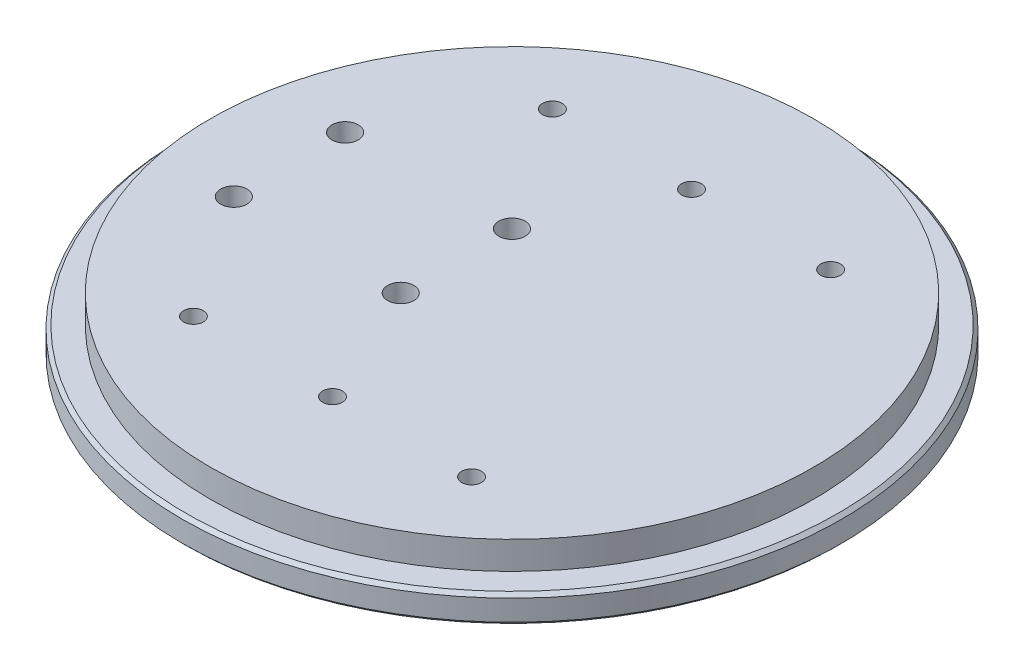
ISO-10303-21;
HEADER;
FILE_DESCRIPTION(('STEP AP214'),'2;1');
FILE_NAME('part.step','',(''),(''),'','','');
FILE_SCHEMA(('AUTOMOTIVE_DESIGN { 1 0 10303 214 1 1 1 1 }'));
ENDSEC;
DATA;
#1=APPLICATION_CONTEXT('core data for automotive mechanical design processes');
#2=APPLICATION_PROTOCOL_DEFINITION('international standard','automotive_design',2000,#1);
#3=PRODUCT_CONTEXT('',#1,'mechanical');
#4=PRODUCT('Part','Part','',(#3));
#5=PRODUCT_RELATED_PRODUCT_CATEGORY('part','',(#4));
#6=PRODUCT_DEFINITION_FORMATION('','',#4);
#7=PRODUCT_DEFINITION_CONTEXT('part definition',#1,'design');
#8=PRODUCT_DEFINITION('design','',#6,#7);
#9=PRODUCT_DEFINITION_SHAPE('','',#8);
#10=(LENGTH_UNIT() NAMED_UNIT(*) SI_UNIT(.MILLI.,.METRE.));
#11=(NAMED_UNIT(*) PLANE_ANGLE_UNIT() SI_UNIT($,.RADIAN.));
#12=(NAMED_UNIT(*) SI_UNIT($,.STERADIAN.) SOLID_ANGLE_UNIT());
#13=UNCERTAINTY_MEASURE_WITH_UNIT(LENGTH_MEASURE(1.E-05),#10,'distance_accuracy_value','');
#14=(GEOMETRIC_REPRESENTATION_CONTEXT(3) GLOBAL_UNCERTAINTY_ASSIGNED_CONTEXT((#13)) GLOBAL_UNIT_ASSIGNED_CONTEXT((#10,
#11,#12)) REPRESENTATION_CONTEXT('',''));
#15=CARTESIAN_POINT('',(0.,0.,0.));
#16=DIRECTION('',(0.,0.,1.));
#17=DIRECTION('',(1.,0.,0.));
#18=AXIS2_PLACEMENT_3D('',#15,#16,#17);
#19=CARTESIAN_POINT('',(0.,-114.3,0.));
#20=DIRECTION('',(0.,-1.,0.));
#21=DIRECTION('',(0.,0.,-1.));
#22=AXIS2_PLACEMENT_3D('',#19,#20,#21);
#23=PLANE('',#22);
#24=CARTESIAN_POINT('',(0.,-114.3,0.));
#25=DIRECTION('',(0.,-1.,0.));
#26=DIRECTION('',(0.,0.,-1.));
#27=AXIS2_PLACEMENT_3D('',#24,#25,#26);
#28=CIRCLE('',#27,74.4388043157519);
#29=CARTESIAN_POINT('',(0.,-114.3,74.4388043157519));
#30=VERTEX_POINT('',#29);
#31=EDGE_CURVE('E206',#30,#30,#28,.T.);
#32=ORIENTED_EDGE('',*,*,#31,.T.);
#33=EDGE_LOOP('',(#32));
#34=FACE_BOUND('',#33,.T.);
#35=CARTESIAN_POINT('',(0.,-114.3,0.));
#36=DIRECTION('',(0.,-1.,0.));
#37=DIRECTION('',(0.,0.,-1.));
#38=AXIS2_PLACEMENT_3D('',#35,#36,#37);
#39=CIRCLE('',#38,8.);
#40=CARTESIAN_POINT('',(5.96284793999944,-114.3,5.33333333333333));
#41=VERTEX_POINT('',#40);
#42=CARTESIAN_POINT('',(5.96284793999944,-114.3,-5.33333333333333));
#43=VERTEX_POINT('',#42);
#44=EDGE_CURVE('E188',#41,#43,#39,.T.);
#45=ORIENTED_EDGE('',*,*,#44,.F.);
#46=CARTESIAN_POINT('',(8.94427190999916,-114.3,8.));
#47=DIRECTION('',(0.,-1.,0.));
#48=DIRECTION('',(0.,0.,-1.));
#49=AXIS2_PLACEMENT_3D('',#46,#47,#48);
#50=CIRCLE('',#49,4.);
#51=CARTESIAN_POINT('',(8.94427190999917,-114.3,4.));
#52=VERTEX_POINT('',#51);
#53=EDGE_CURVE('E152',#41,#52,#50,.T.);
#54=ORIENTED_EDGE('',*,*,#53,.T.);
#55=DIRECTION('',(-1.,0.,0.));
#56=VECTOR('',#55,1.);
#57=CARTESIAN_POINT('',(28.,-114.3,4.));
#58=LINE('',#57,#56);
#59=CARTESIAN_POINT('',(24.,-114.3,4.));
#60=VERTEX_POINT('',#59);
#61=EDGE_CURVE('E194',#60,#52,#58,.T.);
#62=ORIENTED_EDGE('',*,*,#61,.F.);
#63=CARTESIAN_POINT('',(24.,-114.3,0.));
#64=DIRECTION('',(0.,-1.,0.));
#65=DIRECTION('',(0.,0.,-1.));
#66=AXIS2_PLACEMENT_3D('',#63,#64,#65);
#67=CIRCLE('',#66,4.);
#68=CARTESIAN_POINT('',(28.,-114.3,0.));
#69=VERTEX_POINT('',#68);
#70=EDGE_CURVE('E60',#60,#69,#67,.F.);
#71=ORIENTED_EDGE('',*,*,#70,.T.);
#72=CARTESIAN_POINT('',(24.,-114.3,0.));
#73=DIRECTION('',(0.,-1.,0.));
#74=DIRECTION('',(0.,0.,-1.));
#75=AXIS2_PLACEMENT_3D('',#72,#73,#74);
#76=CIRCLE('',#75,4.);
#77=CARTESIAN_POINT('',(24.,-114.3,-4.));
#78=VERTEX_POINT('',#77);
#79=EDGE_CURVE('E13',#69,#78,#76,.F.);
#80=ORIENTED_EDGE('',*,*,#79,.T.);
#81=DIRECTION('',(1.,0.,0.));
#82=VECTOR('',#81,1.);
#83=CARTESIAN_POINT('',(28.,-114.3,-4.));
#84=LINE('',#83,#82);
#85=CARTESIAN_POINT('',(8.94427190999917,-114.3,-4.));
#86=VERTEX_POINT('',#85);
#87=EDGE_CURVE('E128',#86,#78,#84,.T.);
#88=ORIENTED_EDGE('',*,*,#87,.F.);
#89=CARTESIAN_POINT('',(8.94427190999916,-114.3,-7.99999999999999));
#90=DIRECTION('',(0.,-1.,0.));
#91=DIRECTION('',(0.,0.,-1.));
#92=AXIS2_PLACEMENT_3D('',#89,#90,#91);
#93=CIRCLE('',#92,4.);
#94=EDGE_CURVE('E149',#86,#43,#93,.T.);
#95=ORIENTED_EDGE('',*,*,#94,.T.);
#96=EDGE_LOOP('',(#45,#54,#62,#71,#80,#88,#95));
#97=FACE_BOUND('',#96,.T.);
#98=ADVANCED_FACE('F50',(#34,#97),#23,.T.);
#99=CARTESIAN_POINT('',(0.,-107.95,0.));
#100=DIRECTION('',(0.,-1.,0.));
#101=DIRECTION('',(0.,0.,-1.));
#102=AXIS2_PLACEMENT_3D('',#99,#100,#101);
#103=CYLINDRICAL_SURFACE('',#102,8.);
#104=CARTESIAN_POINT('',(0.,-107.95,0.));
#105=DIRECTION('',(0.,-1.,0.));
#106=DIRECTION('',(0.,0.,-1.));
#107=AXIS2_PLACEMENT_3D('',#104,#105,#106);
#108=CIRCLE('',#107,8.);
#109=CARTESIAN_POINT('',(5.96284793999944,-107.95,5.33333333333333));
#110=VERTEX_POINT('',#109);
#111=CARTESIAN_POINT('',(5.96284793999944,-107.95,-5.33333333333333));
#112=VERTEX_POINT('',#111);
#113=EDGE_CURVE('E174',#110,#112,#108,.T.);
#114=ORIENTED_EDGE('',*,*,#113,.F.);
#115=DIRECTION('',(0.,-1.,0.));
#116=VECTOR('',#115,1.);
#117=CARTESIAN_POINT('',(5.96284793999944,-107.95,5.33333333333333));
#118=LINE('',#117,#116);
#119=EDGE_CURVE('E146',#110,#41,#118,.T.);
#120=ORIENTED_EDGE('',*,*,#119,.T.);
#121=ORIENTED_EDGE('',*,*,#44,.T.);
#122=DIRECTION('',(0.,-1.,0.));
#123=VECTOR('',#122,1.);
#124=CARTESIAN_POINT('',(5.96284793999944,-107.95,-5.33333333333333));
#125=LINE('',#124,#123);
#126=EDGE_CURVE('E137',#43,#112,#125,.F.);
#127=ORIENTED_EDGE('',*,*,#126,.T.);
#128=EDGE_LOOP('',(#114,#120,#121,#127));
#129=FACE_BOUND('',#128,.T.);
#130=ADVANCED_FACE('F191',(#129),#103,.F.);
#131=CARTESIAN_POINT('',(0.,-107.95,0.));
#132=DIRECTION('',(0.,1.,0.));
#133=DIRECTION('',(0.,0.,1.));
#134=AXIS2_PLACEMENT_3D('',#131,#132,#133);
#135=CYLINDRICAL_SURFACE('',#134,68.8825543157519);
#136=CARTESIAN_POINT('',(0.,-107.95,0.));
#137=DIRECTION('',(0.,-1.,0.));
#138=DIRECTION('',(0.,0.,-1.));
#139=AXIS2_PLACEMENT_3D('',#136,#137,#138);
#140=CIRCLE('',#139,68.8825543157519);
#141=CARTESIAN_POINT('',(0.,-107.95,-68.8825543157519));
#142=VERTEX_POINT('',#141);
#143=EDGE_CURVE('E202',#142,#142,#140,.T.);
#144=ORIENTED_EDGE('',*,*,#143,.F.);
#145=EDGE_LOOP('',(#144));
#146=FACE_BOUND('',#145,.T.);
#147=CARTESIAN_POINT('',(0.,-101.6,0.));
#148=DIRECTION('',(0.,-1.,0.));
#149=DIRECTION('',(0.,0.,-1.));
#150=AXIS2_PLACEMENT_3D('',#147,#148,#149);
#151=CIRCLE('',#150,68.8825543157519);
#152=CARTESIAN_POINT('',(0.,-101.6,-68.8825543157519));
#153=VERTEX_POINT('',#152);
#154=EDGE_CURVE('E198',#153,#153,#151,.T.);
#155=ORIENTED_EDGE('',*,*,#154,.T.);
#156=EDGE_LOOP('',(#155));
#157=FACE_BOUND('',#156,.T.);
#158=ADVANCED_FACE('F237',(#146,#157),#135,.T.);
#159=CARTESIAN_POINT('',(0.,-101.6,0.));
#160=DIRECTION('',(0.,-1.,0.));
#161=DIRECTION('',(0.,0.,-1.));
#162=AXIS2_PLACEMENT_3D('',#159,#160,#161);
#163=PLANE('',#162);
#164=ORIENTED_EDGE('',*,*,#154,.F.);
#165=EDGE_LOOP('',(#164));
#166=FACE_BOUND('',#165,.T.);
#167=CARTESIAN_POINT('',(-50.8,-101.6,-12.7));
#168=DIRECTION('',(0.,1.,0.));
#169=DIRECTION('',(0.,0.,1.));
#170=AXIS2_PLACEMENT_3D('',#167,#168,#169);
#171=CIRCLE('',#170,3.);
#172=CARTESIAN_POINT('',(-50.8,-101.6,-9.7));
#173=VERTEX_POINT('',#172);
#174=EDGE_CURVE('E316',#173,#173,#171,.T.);
#175=ORIENTED_EDGE('',*,*,#174,.F.);
#176=EDGE_LOOP('',(#175));
#177=FACE_BOUND('',#176,.T.);
#178=CARTESIAN_POINT('',(-12.7,-101.6,12.7));
#179=DIRECTION('',(0.,1.,0.));
#180=DIRECTION('',(0.,0.,1.));
#181=AXIS2_PLACEMENT_3D('',#178,#179,#180);
#182=CIRCLE('',#181,3.);
#183=CARTESIAN_POINT('',(-12.7,-101.6,15.7));
#184=VERTEX_POINT('',#183);
#185=EDGE_CURVE('E324',#184,#184,#182,.T.);
#186=ORIENTED_EDGE('',*,*,#185,.F.);
#187=EDGE_LOOP('',(#186));
#188=FACE_BOUND('',#187,.T.);
#189=CARTESIAN_POINT('',(-50.8,-101.6,12.7));
#190=DIRECTION('',(0.,1.,0.));
#191=DIRECTION('',(0.,0.,1.));
#192=AXIS2_PLACEMENT_3D('',#189,#190,#191);
#193=CIRCLE('',#192,3.);
#194=CARTESIAN_POINT('',(-50.8,-101.6,15.7));
#195=VERTEX_POINT('',#194);
#196=EDGE_CURVE('E325',#195,#195,#193,.T.);
#197=ORIENTED_EDGE('',*,*,#196,.F.);
#198=EDGE_LOOP('',(#197));
#199=FACE_BOUND('',#198,.T.);
#200=CARTESIAN_POINT('',(-12.7,-101.6,-12.7));
#201=DIRECTION('',(0.,1.,0.));
#202=DIRECTION('',(0.,0.,1.));
#203=AXIS2_PLACEMENT_3D('',#200,#201,#202);
#204=CIRCLE('',#203,3.);
#205=CARTESIAN_POINT('',(-12.7,-101.6,-9.7));
#206=VERTEX_POINT('',#205);
#207=EDGE_CURVE('E311',#206,#206,#204,.T.);
#208=ORIENTED_EDGE('',*,*,#207,.F.);
#209=EDGE_LOOP('',(#208));
#210=FACE_BOUND('',#209,.T.);
#211=CARTESIAN_POINT('',(-31.75,-101.6,40.979606549068));
#212=DIRECTION('',(0.,-1.,0.));
#213=DIRECTION('',(0.,0.,-1.));
#214=AXIS2_PLACEMENT_3D('',#211,#212,#213);
#215=CIRCLE('',#214,2.25);
#216=CARTESIAN_POINT('',(-31.75,-101.6,38.729606549068));
#217=VERTEX_POINT('',#216);
#218=EDGE_CURVE('E355',#217,#217,#215,.T.);
#219=ORIENTED_EDGE('',*,*,#218,.T.);
#220=EDGE_LOOP('',(#219));
#221=FACE_BOUND('',#220,.T.);
#222=CARTESIAN_POINT('',(31.75,-101.6,40.979606549068));
#223=DIRECTION('',(0.,-1.,0.));
#224=DIRECTION('',(0.,0.,-1.));
#225=AXIS2_PLACEMENT_3D('',#222,#223,#224);
#226=CIRCLE('',#225,2.25);
#227=CARTESIAN_POINT('',(31.75,-101.6,38.729606549068));
#228=VERTEX_POINT('',#227);
#229=EDGE_CURVE('E359',#228,#228,#226,.T.);
#230=ORIENTED_EDGE('',*,*,#229,.T.);
#231=EDGE_LOOP('',(#230));
#232=FACE_BOUND('',#231,.T.);
#233=CARTESIAN_POINT('',(0.,-101.6,40.979606549068));
#234=DIRECTION('',(0.,-1.,0.));
#235=DIRECTION('',(0.,0.,-1.));
#236=AXIS2_PLACEMENT_3D('',#233,#234,#235);
#237=CIRCLE('',#236,2.25);
#238=CARTESIAN_POINT('',(0.,-101.6,38.729606549068));
#239=VERTEX_POINT('',#238);
#240=EDGE_CURVE('E363',#239,#239,#237,.T.);
#241=ORIENTED_EDGE('',*,*,#240,.T.);
#242=EDGE_LOOP('',(#241));
#243=FACE_BOUND('',#242,.T.);
#244=CARTESIAN_POINT('',(0.,-101.6,-40.979606549068));
#245=DIRECTION('',(0.,-1.,0.));
#246=DIRECTION('',(0.,0.,-1.));
#247=AXIS2_PLACEMENT_3D('',#244,#245,#246);
#248=CIRCLE('',#247,2.25);
#249=CARTESIAN_POINT('',(0.,-101.6,-43.229606549068));
#250=VERTEX_POINT('',#249);
#251=EDGE_CURVE('E347',#250,#250,#248,.F.);
#252=ORIENTED_EDGE('',*,*,#251,.F.);
#253=EDGE_LOOP('',(#252));
#254=FACE_BOUND('',#253,.T.);
#255=CARTESIAN_POINT('',(31.75,-101.6,-40.979606549068));
#256=DIRECTION('',(0.,-1.,0.));
#257=DIRECTION('',(0.,0.,-1.));
#258=AXIS2_PLACEMENT_3D('',#255,#256,#257);
#259=CIRCLE('',#258,2.25);
#260=CARTESIAN_POINT('',(31.75,-101.6,-43.229606549068));
#261=VERTEX_POINT('',#260);
#262=EDGE_CURVE('E351',#261,#261,#259,.F.);
#263=ORIENTED_EDGE('',*,*,#262,.F.);
#264=EDGE_LOOP('',(#263));
#265=FACE_BOUND('',#264,.T.);
#266=CARTESIAN_POINT('',(-31.75,-101.6,-40.979606549068));
#267=DIRECTION('',(0.,-1.,0.));
#268=DIRECTION('',(0.,0.,-1.));
#269=AXIS2_PLACEMENT_3D('',#266,#267,#268);
#270=CIRCLE('',#269,2.25);
#271=CARTESIAN_POINT('',(-31.75,-101.6,-43.229606549068));
#272=VERTEX_POINT('',#271);
#273=EDGE_CURVE('E340',#272,#272,#270,.F.);
#274=ORIENTED_EDGE('',*,*,#273,.F.);
#275=EDGE_LOOP('',(#274));
#276=FACE_BOUND('',#275,.T.);
#277=ADVANCED_FACE('F246',(#166,#177,#188,#199,#210,#221,#232,#243,#254,#265,#276),#163,.F.);
#278=CARTESIAN_POINT('',(0.,-114.3,0.));
#279=DIRECTION('',(0.,1.,0.));
#280=DIRECTION('',(0.,0.,1.));
#281=AXIS2_PLACEMENT_3D('',#278,#279,#280);
#282=CYLINDRICAL_SURFACE('',#281,75.2325543157519);
#283=CARTESIAN_POINT('',(0.,-113.50625,0.));
#284=DIRECTION('',(0.,-1.,0.));
#285=DIRECTION('',(0.,0.,-1.));
#286=AXIS2_PLACEMENT_3D('',#283,#284,#285);
#287=CIRCLE('',#286,75.2325543157519);
#288=CARTESIAN_POINT('',(0.,-113.50625,75.2325543157519));
#289=VERTEX_POINT('',#288);
#290=EDGE_CURVE('E140',#289,#289,#287,.F.);
#291=ORIENTED_EDGE('',*,*,#290,.T.);
#292=EDGE_LOOP('',(#291));
#293=FACE_BOUND('',#292,.T.);
#294=CARTESIAN_POINT('',(0.,-108.74375,0.));
#295=DIRECTION('',(0.,-1.,0.));
#296=DIRECTION('',(0.,0.,-1.));
#297=AXIS2_PLACEMENT_3D('',#294,#295,#296);
#298=CIRCLE('',#297,75.2325543157519);
#299=CARTESIAN_POINT('',(0.,-108.74375,-75.2325543157519));
#300=VERTEX_POINT('',#299);
#301=EDGE_CURVE('E213',#300,#300,#298,.T.);
#302=ORIENTED_EDGE('',*,*,#301,.T.);
#303=EDGE_LOOP('',(#302));
#304=FACE_BOUND('',#303,.T.);
#305=ADVANCED_FACE('F220',(#293,#304),#282,.T.);
#306=CARTESIAN_POINT('',(0.,-107.95,0.));
#307=DIRECTION('',(0.,-1.,0.));
#308=DIRECTION('',(0.,0.,-1.));
#309=AXIS2_PLACEMENT_3D('',#306,#307,#308);
#310=PLANE('',#309);
#311=CARTESIAN_POINT('',(0.,-107.95,0.));
#312=DIRECTION('',(0.,-1.,0.));
#313=DIRECTION('',(0.,0.,-1.));
#314=AXIS2_PLACEMENT_3D('',#311,#312,#313);
#315=CIRCLE('',#314,74.4388043157519);
#316=CARTESIAN_POINT('',(0.,-107.95,-74.4388043157519));
#317=VERTEX_POINT('',#316);
#318=EDGE_CURVE('E133',#317,#317,#315,.F.);
#319=ORIENTED_EDGE('',*,*,#318,.T.);
#320=EDGE_LOOP('',(#319));
#321=FACE_BOUND('',#320,.T.);
#322=ORIENTED_EDGE('',*,*,#143,.T.);
#323=EDGE_LOOP('',(#322));
#324=FACE_BOUND('',#323,.T.);
#325=ADVANCED_FACE('F227',(#321,#324),#310,.F.);
#326=CARTESIAN_POINT('',(0.,-114.3,0.));
#327=DIRECTION('',(0.,1.,0.));
#328=DIRECTION('',(0.,0.,1.));
#329=AXIS2_PLACEMENT_3D('',#326,#327,#328);
#330=CONICAL_SURFACE('',#329,74.4388043157519,0.785398163397466);
#331=CARTESIAN_POINT('',(0.,-113.50625,75.2325543157519));
#332=CARTESIAN_POINT('',(0.,-113.514518229167,75.2242860865852));
#333=CARTESIAN_POINT('',(0.,-113.522786458333,75.2160178574185));
#334=CARTESIAN_POINT('',(0.,-113.539322916667,75.1994813990852));
#335=CARTESIAN_POINT('',(0.,-113.547591145833,75.1912131699185));
#336=CARTESIAN_POINT('',(0.,-113.564127604167,75.1746767115852));
#337=CARTESIAN_POINT('',(0.,-113.572395833333,75.1664084824185));
#338=CARTESIAN_POINT('',(0.,-113.588932291667,75.1498720240852));
#339=CARTESIAN_POINT('',(0.,-113.597200520833,75.1416037949185));
#340=CARTESIAN_POINT('',(0.,-113.613736979167,75.1250673365852));
#341=CARTESIAN_POINT('',(0.,-113.622005208333,75.1167991074185));
#342=CARTESIAN_POINT('',(0.,-113.638541666667,75.1002626490852));
#343=CARTESIAN_POINT('',(0.,-113.646809895833,75.0919944199185));
#344=CARTESIAN_POINT('',(0.,-113.663346354167,75.0754579615852));
#345=CARTESIAN_POINT('',(0.,-113.671614583333,75.0671897324185));
#346=CARTESIAN_POINT('',(0.,-113.688151041667,75.0506532740852));
#347=CARTESIAN_POINT('',(0.,-113.696419270833,75.0423850449185));
#348=CARTESIAN_POINT('',(0.,-113.712955729167,75.0258485865852));
#349=CARTESIAN_POINT('',(0.,-113.721223958333,75.0175803574185));
#350=CARTESIAN_POINT('',(0.,-113.737760416667,75.0010438990852));
#351=CARTESIAN_POINT('',(0.,-113.746028645833,74.9927756699185));
#352=CARTESIAN_POINT('',(0.,-113.762565104167,74.9762392115852));
#353=CARTESIAN_POINT('',(0.,-113.770833333333,74.9679709824185));
#354=CARTESIAN_POINT('',(0.,-113.787369791667,74.9514345240852));
#355=CARTESIAN_POINT('',(0.,-113.795638020833,74.9431662949185));
#356=CARTESIAN_POINT('',(0.,-113.812174479167,74.9266298365852));
#357=CARTESIAN_POINT('',(0.,-113.820442708333,74.9183616074185));
#358=CARTESIAN_POINT('',(0.,-113.836979166667,74.9018251490852));
#359=CARTESIAN_POINT('',(0.,-113.845247395833,74.8935569199185));
#360=CARTESIAN_POINT('',(0.,-113.861783854167,74.8770204615852));
#361=CARTESIAN_POINT('',(0.,-113.870052083333,74.8687522324186));
#362=CARTESIAN_POINT('',(0.,-113.886588541667,74.8522157740852));
#363=CARTESIAN_POINT('',(0.,-113.894856770833,74.8439475449185));
#364=CARTESIAN_POINT('',(0.,-113.911393229167,74.8274110865852));
#365=CARTESIAN_POINT('',(0.,-113.919661458333,74.8191428574185));
#366=CARTESIAN_POINT('',(0.,-113.936197916667,74.8026063990852));
#367=CARTESIAN_POINT('',(0.,-113.944466145833,74.7943381699185));
#368=CARTESIAN_POINT('',(0.,-113.961002604167,74.7778017115852));
#369=CARTESIAN_POINT('',(0.,-113.969270833333,74.7695334824186));
#370=CARTESIAN_POINT('',(0.,-113.985807291667,74.7529970240852));
#371=CARTESIAN_POINT('',(0.,-113.994075520833,74.7447287949186));
#372=CARTESIAN_POINT('',(0.,-114.010611979167,74.7281923365852));
#373=CARTESIAN_POINT('',(0.,-114.018880208333,74.7199241074185));
#374=CARTESIAN_POINT('',(0.,-114.035416666667,74.7033876490852));
#375=CARTESIAN_POINT('',(0.,-114.043684895833,74.6951194199186));
#376=CARTESIAN_POINT('',(0.,-114.060221354167,74.6785829615852));
#377=CARTESIAN_POINT('',(0.,-114.068489583333,74.6703147324186));
#378=CARTESIAN_POINT('',(0.,-114.085026041667,74.6537782740852));
#379=CARTESIAN_POINT('',(0.,-114.093294270833,74.6455100449186));
#380=CARTESIAN_POINT('',(0.,-114.109830729167,74.6289735865852));
#381=CARTESIAN_POINT('',(0.,-114.118098958333,74.6207053574186));
#382=CARTESIAN_POINT('',(0.,-114.134635416667,74.6041688990852));
#383=CARTESIAN_POINT('',(0.,-114.142903645833,74.5959006699186));
#384=CARTESIAN_POINT('',(0.,-114.159440104167,74.5793642115852));
#385=CARTESIAN_POINT('',(0.,-114.167708333333,74.5710959824186));
#386=CARTESIAN_POINT('',(0.,-114.184244791667,74.5545595240852));
#387=CARTESIAN_POINT('',(0.,-114.192513020833,74.5462912949186));
#388=CARTESIAN_POINT('',(0.,-114.209049479167,74.5297548365852));
#389=CARTESIAN_POINT('',(0.,-114.217317708333,74.5214866074186));
#390=CARTESIAN_POINT('',(0.,-114.233854166667,74.5049501490852));
#391=CARTESIAN_POINT('',(0.,-114.242122395833,74.4966819199186));
#392=CARTESIAN_POINT('',(0.,-114.258658854167,74.4801454615852));
#393=CARTESIAN_POINT('',(0.,-114.266927083333,74.4718772324186));
#394=CARTESIAN_POINT('',(0.,-114.283463541667,74.4553407740852));
#395=CARTESIAN_POINT('',(0.,-114.291731770833,74.4470725449186));
#396=CARTESIAN_POINT('',(0.,-114.3,74.4388043157519));
#397=B_SPLINE_CURVE_WITH_KNOTS('',3,(#331,#332,#333,#334,#335,#336,#337,#338,#339,#340,#341,
#342,#343,#344,#345,#346,#347,#348,#349,#350,#351,#352,#353,#354,#355,#356,#357,#358,#359,#360,
#361,#362,#363,#364,#365,#366,#367,#368,#369,#370,#371,#372,#373,#374,#375,#376,#377,#378,#379,
#380,#381,#382,#383,#384,#385,#386,#387,#388,#389,#390,#391,#392,#393,#394,#395,#396),
.UNSPECIFIED.,.F.,.F.,(4,2,2,2,2,2,2,2,2,2,2,2,2,2,2,2,2,2,2,2,2,2,2,2,2,2,2,2,2,2,2,2,4),(0.,
0.0350791254729133,0.0701582509458463,0.10523737641876,0.140316501891693,0.175395627364606,
0.210474752837539,0.245553878310462,0.280633003783385,0.315712129256308,0.350791254729231,
0.385870380202154,0.420949505675087,0.456028631148001,0.491107756620934,0.526186882093847,
0.56126600756678,0.596345133039713,0.631424258512626,0.666503383985559,0.701582509458473,
0.736661634931406,0.771740760404329,0.806819885877252,0.841899011350175,0.876978136823098,
0.912057262296021,0.947136387768954,0.982215513241867,1.0172946387148,1.05237376418771,
1.08745288966065,1.12253201513357),.UNSPECIFIED.);
#398=EDGE_CURVE('BSEAM223',#289,#30,#397,.T.);
#399=ORIENTED_EDGE('',*,*,#290,.F.);
#400=ORIENTED_EDGE('',*,*,#31,.F.);
#401=ORIENTED_EDGE('',*,*,#398,.T.);
#402=ORIENTED_EDGE('',*,*,#398,.F.);
#403=EDGE_LOOP('',(#399,#401,#400,#402));
#404=FACE_BOUND('',#403,.T.);
#405=ADVANCED_FACE('F223',(#404),#330,.T.);
#406=CARTESIAN_POINT('',(0.,-108.74375,0.));
#407=DIRECTION('',(0.,-1.,0.));
#408=DIRECTION('',(0.,0.,-1.));
#409=AXIS2_PLACEMENT_3D('',#406,#407,#408);
#410=CONICAL_SURFACE('',#409,75.2325543157519,0.78539816339744);
#411=ORIENTED_EDGE('',*,*,#318,.F.);
#412=EDGE_LOOP('',(#411));
#413=FACE_BOUND('',#412,.T.);
#414=ORIENTED_EDGE('',*,*,#301,.F.);
#415=EDGE_LOOP('',(#414));
#416=FACE_BOUND('',#415,.T.);
#417=ADVANCED_FACE('F226',(#413,#416),#410,.T.);
#418=CARTESIAN_POINT('',(0.,-107.95,0.));
#419=DIRECTION('',(0.,-1.,0.));
#420=DIRECTION('',(0.,0.,-1.));
#421=AXIS2_PLACEMENT_3D('',#418,#419,#420);
#422=PLANE('',#421);
#423=CARTESIAN_POINT('',(24.,-107.95,0.));
#424=DIRECTION('',(0.,-1.,0.));
#425=DIRECTION('',(0.,0.,-1.));
#426=AXIS2_PLACEMENT_3D('',#423,#424,#425);
#427=CIRCLE('',#426,4.);
#428=CARTESIAN_POINT('',(24.,-107.95,-4.));
#429=VERTEX_POINT('',#428);
#430=CARTESIAN_POINT('',(28.,-107.95,0.));
#431=VERTEX_POINT('',#430);
#432=EDGE_CURVE('E73',#429,#431,#427,.T.);
#433=ORIENTED_EDGE('',*,*,#432,.T.);
#434=CARTESIAN_POINT('',(24.,-107.95,0.));
#435=DIRECTION('',(0.,-1.,0.));
#436=DIRECTION('',(0.,0.,-1.));
#437=AXIS2_PLACEMENT_3D('',#434,#435,#436);
#438=CIRCLE('',#437,4.);
#439=CARTESIAN_POINT('',(24.,-107.95,4.));
#440=VERTEX_POINT('',#439);
#441=EDGE_CURVE('E109',#431,#440,#438,.T.);
#442=ORIENTED_EDGE('',*,*,#441,.T.);
#443=DIRECTION('',(-1.,0.,0.));
#444=VECTOR('',#443,1.);
#445=CARTESIAN_POINT('',(28.,-107.95,4.));
#446=LINE('',#445,#444);
#447=CARTESIAN_POINT('',(8.94427190999917,-107.95,4.));
#448=VERTEX_POINT('',#447);
#449=EDGE_CURVE('E112',#440,#448,#446,.T.);
#450=ORIENTED_EDGE('',*,*,#449,.T.);
#451=CARTESIAN_POINT('',(8.94427190999916,-107.95,8.));
#452=DIRECTION('',(0.,-1.,0.));
#453=DIRECTION('',(0.,0.,-1.));
#454=AXIS2_PLACEMENT_3D('',#451,#452,#453);
#455=CIRCLE('',#454,4.);
#456=EDGE_CURVE('E117',#448,#110,#455,.F.);
#457=ORIENTED_EDGE('',*,*,#456,.T.);
#458=ORIENTED_EDGE('',*,*,#113,.T.);
#459=CARTESIAN_POINT('',(8.94427190999916,-107.95,-7.99999999999999));
#460=DIRECTION('',(0.,-1.,0.));
#461=DIRECTION('',(0.,0.,-1.));
#462=AXIS2_PLACEMENT_3D('',#459,#460,#461);
#463=CIRCLE('',#462,4.);
#464=CARTESIAN_POINT('',(8.94427190999917,-107.95,-4.));
#465=VERTEX_POINT('',#464);
#466=EDGE_CURVE('E166',#112,#465,#463,.F.);
#467=ORIENTED_EDGE('',*,*,#466,.T.);
#468=DIRECTION('',(1.,0.,0.));
#469=VECTOR('',#468,1.);
#470=CARTESIAN_POINT('',(28.,-107.95,-4.));
#471=LINE('',#470,#469);
#472=EDGE_CURVE('E129',#465,#429,#471,.T.);
#473=ORIENTED_EDGE('',*,*,#472,.T.);
#474=EDGE_LOOP('',(#433,#442,#450,#457,#458,#467,#473));
#475=FACE_BOUND('',#474,.T.);
#476=ADVANCED_FACE('F111',(#475),#422,.T.);
#477=CARTESIAN_POINT('',(28.,-114.3,-4.));
#478=DIRECTION('',(0.,0.,1.));
#479=DIRECTION('',(1.,0.,0.));
#480=AXIS2_PLACEMENT_3D('',#477,#478,#479);
#481=PLANE('',#480);
#482=ORIENTED_EDGE('',*,*,#472,.F.);
#483=DIRECTION('',(0.,1.,0.));
#484=VECTOR('',#483,1.);
#485=CARTESIAN_POINT('',(8.94427190999916,-114.3,-4.));
#486=LINE('',#485,#484);
#487=EDGE_CURVE('E158',#465,#86,#486,.F.);
#488=ORIENTED_EDGE('',*,*,#487,.T.);
#489=ORIENTED_EDGE('',*,*,#87,.T.);
#490=DIRECTION('',(0.,1.,0.));
#491=VECTOR('',#490,1.);
#492=CARTESIAN_POINT('',(24.,-107.95,-4.));
#493=LINE('',#492,#491);
#494=EDGE_CURVE('E155',#78,#429,#493,.T.);
#495=ORIENTED_EDGE('',*,*,#494,.T.);
#496=EDGE_LOOP('',(#482,#488,#489,#495));
#497=FACE_BOUND('',#496,.T.);
#498=ADVANCED_FACE('F179',(#497),#481,.T.);
#499=CARTESIAN_POINT('',(28.,-114.3,4.));
#500=DIRECTION('',(0.,0.,-1.));
#501=DIRECTION('',(-1.,0.,0.));
#502=AXIS2_PLACEMENT_3D('',#499,#500,#501);
#503=PLANE('',#502);
#504=ORIENTED_EDGE('',*,*,#61,.T.);
#505=DIRECTION('',(0.,1.,0.));
#506=VECTOR('',#505,1.);
#507=CARTESIAN_POINT('',(8.94427190999916,-107.95,4.));
#508=LINE('',#507,#506);
#509=EDGE_CURVE('E126',#52,#448,#508,.T.);
#510=ORIENTED_EDGE('',*,*,#509,.T.);
#511=ORIENTED_EDGE('',*,*,#449,.F.);
#512=DIRECTION('',(0.,1.,0.));
#513=VECTOR('',#512,1.);
#514=CARTESIAN_POINT('',(24.,-114.3,4.));
#515=LINE('',#514,#513);
#516=EDGE_CURVE('E124',#440,#60,#515,.F.);
#517=ORIENTED_EDGE('',*,*,#516,.T.);
#518=EDGE_LOOP('',(#504,#510,#511,#517));
#519=FACE_BOUND('',#518,.T.);
#520=ADVANCED_FACE('F123',(#519),#503,.T.);
#521=CARTESIAN_POINT('',(8.94427190999916,-107.95,8.));
#522=DIRECTION('',(0.,-1.,0.));
#523=DIRECTION('',(0.,0.,-1.));
#524=AXIS2_PLACEMENT_3D('',#521,#522,#523);
#525=CYLINDRICAL_SURFACE('',#524,4.);
#526=ORIENTED_EDGE('',*,*,#53,.F.);
#527=ORIENTED_EDGE('',*,*,#119,.F.);
#528=ORIENTED_EDGE('',*,*,#456,.F.);
#529=ORIENTED_EDGE('',*,*,#509,.F.);
#530=EDGE_LOOP('',(#526,#527,#528,#529));
#531=FACE_BOUND('',#530,.T.);
#532=ADVANCED_FACE('F261',(#531),#525,.T.);
#533=CARTESIAN_POINT('',(8.94427190999916,-107.95,-7.99999999999999));
#534=DIRECTION('',(0.,-1.,0.));
#535=DIRECTION('',(0.,0.,-1.));
#536=AXIS2_PLACEMENT_3D('',#533,#534,#535);
#537=CYLINDRICAL_SURFACE('',#536,4.);
#538=ORIENTED_EDGE('',*,*,#466,.F.);
#539=ORIENTED_EDGE('',*,*,#126,.F.);
#540=ORIENTED_EDGE('',*,*,#94,.F.);
#541=ORIENTED_EDGE('',*,*,#487,.F.);
#542=EDGE_LOOP('',(#538,#539,#540,#541));
#543=FACE_BOUND('',#542,.T.);
#544=ADVANCED_FACE('F185',(#543),#537,.T.);
#545=CARTESIAN_POINT('',(24.,-114.3,0.));
#546=DIRECTION('',(0.,-1.,0.));
#547=DIRECTION('',(0.,0.,-1.));
#548=AXIS2_PLACEMENT_3D('',#545,#546,#547);
#549=CYLINDRICAL_SURFACE('',#548,4.);
#550=ORIENTED_EDGE('',*,*,#494,.F.);
#551=ORIENTED_EDGE('',*,*,#79,.F.);
#552=DIRECTION('',(0.,1.,0.));
#553=VECTOR('',#552,1.);
#554=CARTESIAN_POINT('',(28.,-114.3,0.));
#555=LINE('',#554,#553);
#556=EDGE_CURVE('E54',#431,#69,#555,.F.);
#557=ORIENTED_EDGE('',*,*,#556,.F.);
#558=ORIENTED_EDGE('',*,*,#432,.F.);
#559=EDGE_LOOP('',(#550,#551,#557,#558));
#560=FACE_BOUND('',#559,.T.);
#561=ADVANCED_FACE('F52',(#560),#549,.F.);
#562=CARTESIAN_POINT('',(24.,-114.3,0.));
#563=DIRECTION('',(0.,-1.,0.));
#564=DIRECTION('',(0.,0.,-1.));
#565=AXIS2_PLACEMENT_3D('',#562,#563,#564);
#566=CYLINDRICAL_SURFACE('',#565,4.);
#567=ORIENTED_EDGE('',*,*,#70,.F.);
#568=ORIENTED_EDGE('',*,*,#516,.F.);
#569=ORIENTED_EDGE('',*,*,#441,.F.);
#570=ORIENTED_EDGE('',*,*,#556,.T.);
#571=EDGE_LOOP('',(#567,#568,#569,#570));
#572=FACE_BOUND('',#571,.T.);
#573=ADVANCED_FACE('F131',(#572),#566,.F.);
#574=CARTESIAN_POINT('',(-12.7,-107.6,-12.7));
#575=DIRECTION('',(0.,1.,0.));
#576=DIRECTION('',(0.,0.,1.));
#577=AXIS2_PLACEMENT_3D('',#574,#575,#576);
#578=CYLINDRICAL_SURFACE('',#577,3.);
#579=CARTESIAN_POINT('',(-12.7,-107.6,-12.7));
#580=DIRECTION('',(0.,1.,0.));
#581=DIRECTION('',(0.,0.,1.));
#582=AXIS2_PLACEMENT_3D('',#579,#580,#581);
#583=CIRCLE('',#582,3.);
#584=CARTESIAN_POINT('',(-12.7,-107.6,-9.7));
#585=VERTEX_POINT('',#584);
#586=EDGE_CURVE('E315',#585,#585,#583,.T.);
#587=ORIENTED_EDGE('',*,*,#586,.F.);
#588=EDGE_LOOP('',(#587));
#589=FACE_BOUND('',#588,.T.);
#590=ORIENTED_EDGE('',*,*,#207,.T.);
#591=EDGE_LOOP('',(#590));
#592=FACE_BOUND('',#591,.T.);
#593=ADVANCED_FACE('F267',(#589,#592),#578,.F.);
#594=CARTESIAN_POINT('',(-12.7,-107.6,-12.7));
#595=DIRECTION('',(0.,1.,0.));
#596=DIRECTION('',(0.,0.,1.));
#597=AXIS2_PLACEMENT_3D('',#594,#595,#596);
#598=PLANE('',#597);
#599=ORIENTED_EDGE('',*,*,#586,.T.);
#600=EDGE_LOOP('',(#599));
#601=FACE_BOUND('',#600,.T.);
#602=ADVANCED_FACE('F273',(#601),#598,.T.);
#603=CARTESIAN_POINT('',(-50.8,-107.6,12.7));
#604=DIRECTION('',(0.,1.,0.));
#605=DIRECTION('',(0.,0.,1.));
#606=AXIS2_PLACEMENT_3D('',#603,#604,#605);
#607=CYLINDRICAL_SURFACE('',#606,3.);
#608=CARTESIAN_POINT('',(-50.8,-107.6,12.7));
#609=DIRECTION('',(0.,1.,0.));
#610=DIRECTION('',(0.,0.,1.));
#611=AXIS2_PLACEMENT_3D('',#608,#609,#610);
#612=CIRCLE('',#611,3.);
#613=CARTESIAN_POINT('',(-50.8,-107.6,15.7));
#614=VERTEX_POINT('',#613);
#615=EDGE_CURVE('E336',#614,#614,#612,.T.);
#616=ORIENTED_EDGE('',*,*,#615,.F.);
#617=EDGE_LOOP('',(#616));
#618=FACE_BOUND('',#617,.T.);
#619=ORIENTED_EDGE('',*,*,#196,.T.);
#620=EDGE_LOOP('',(#619));
#621=FACE_BOUND('',#620,.T.);
#622=ADVANCED_FACE('F543',(#618,#621),#607,.F.);
#623=CARTESIAN_POINT('',(-50.8,-107.6,12.7));
#624=DIRECTION('',(0.,1.,0.));
#625=DIRECTION('',(0.,0.,1.));
#626=AXIS2_PLACEMENT_3D('',#623,#624,#625);
#627=PLANE('',#626);
#628=ORIENTED_EDGE('',*,*,#615,.T.);
#629=EDGE_LOOP('',(#628));
#630=FACE_BOUND('',#629,.T.);
#631=ADVANCED_FACE('F553',(#630),#627,.T.);
#632=CARTESIAN_POINT('',(-12.7,-107.6,12.7));
#633=DIRECTION('',(0.,1.,0.));
#634=DIRECTION('',(0.,0.,1.));
#635=AXIS2_PLACEMENT_3D('',#632,#633,#634);
#636=CYLINDRICAL_SURFACE('',#635,3.);
#637=CARTESIAN_POINT('',(-12.7,-107.6,12.7));
#638=DIRECTION('',(0.,1.,0.));
#639=DIRECTION('',(0.,0.,1.));
#640=AXIS2_PLACEMENT_3D('',#637,#638,#639);
#641=CIRCLE('',#640,3.);
#642=CARTESIAN_POINT('',(-12.7,-107.6,15.7));
#643=VERTEX_POINT('',#642);
#644=EDGE_CURVE('E320',#643,#643,#641,.T.);
#645=ORIENTED_EDGE('',*,*,#644,.F.);
#646=EDGE_LOOP('',(#645));
#647=FACE_BOUND('',#646,.T.);
#648=ORIENTED_EDGE('',*,*,#185,.T.);
#649=EDGE_LOOP('',(#648));
#650=FACE_BOUND('',#649,.T.);
#651=ADVANCED_FACE('F563',(#647,#650),#636,.F.);
#652=CARTESIAN_POINT('',(-12.7,-107.6,12.7));
#653=DIRECTION('',(0.,1.,0.));
#654=DIRECTION('',(0.,0.,1.));
#655=AXIS2_PLACEMENT_3D('',#652,#653,#654);
#656=PLANE('',#655);
#657=ORIENTED_EDGE('',*,*,#644,.T.);
#658=EDGE_LOOP('',(#657));
#659=FACE_BOUND('',#658,.T.);
#660=ADVANCED_FACE('F573',(#659),#656,.T.);
#661=CARTESIAN_POINT('',(-50.8,-107.6,-12.7));
#662=DIRECTION('',(0.,1.,0.));
#663=DIRECTION('',(0.,0.,1.));
#664=AXIS2_PLACEMENT_3D('',#661,#662,#663);
#665=CYLINDRICAL_SURFACE('',#664,3.);
#666=CARTESIAN_POINT('',(-50.8,-107.6,-12.7));
#667=DIRECTION('',(0.,1.,0.));
#668=DIRECTION('',(0.,0.,1.));
#669=AXIS2_PLACEMENT_3D('',#666,#667,#668);
#670=CIRCLE('',#669,3.);
#671=CARTESIAN_POINT('',(-50.8,-107.6,-9.7));
#672=VERTEX_POINT('',#671);
#673=EDGE_CURVE('E329',#672,#672,#670,.T.);
#674=ORIENTED_EDGE('',*,*,#673,.F.);
#675=EDGE_LOOP('',(#674));
#676=FACE_BOUND('',#675,.T.);
#677=ORIENTED_EDGE('',*,*,#174,.T.);
#678=EDGE_LOOP('',(#677));
#679=FACE_BOUND('',#678,.T.);
#680=ADVANCED_FACE('F583',(#676,#679),#665,.F.);
#681=CARTESIAN_POINT('',(-50.8,-107.6,-12.7));
#682=DIRECTION('',(0.,1.,0.));
#683=DIRECTION('',(0.,0.,1.));
#684=AXIS2_PLACEMENT_3D('',#681,#682,#683);
#685=PLANE('',#684);
#686=ORIENTED_EDGE('',*,*,#673,.T.);
#687=EDGE_LOOP('',(#686));
#688=FACE_BOUND('',#687,.T.);
#689=ADVANCED_FACE('F396',(#688),#685,.T.);
#690=CARTESIAN_POINT('',(0.,-107.6,0.));
#691=DIRECTION('',(0.,-1.,0.));
#692=DIRECTION('',(0.,0.,-1.));
#693=AXIS2_PLACEMENT_3D('',#690,#691,#692);
#694=PLANE('',#693);
#695=CARTESIAN_POINT('',(31.75,-107.6,40.979606549068));
#696=DIRECTION('',(0.,-1.,0.));
#697=DIRECTION('',(0.,0.,-1.));
#698=AXIS2_PLACEMENT_3D('',#695,#696,#697);
#699=CIRCLE('',#698,2.25);
#700=CARTESIAN_POINT('',(31.75,-107.6,38.729606549068));
#701=VERTEX_POINT('',#700);
#702=EDGE_CURVE('E292',#701,#701,#699,.T.);
#703=ORIENTED_EDGE('',*,*,#702,.F.);
#704=EDGE_LOOP('',(#703));
#705=FACE_BOUND('',#704,.T.);
#706=ADVANCED_FACE('F394',(#705),#694,.F.);
#707=CARTESIAN_POINT('',(31.75,-119.963961030679,40.979606549068));
#708=DIRECTION('',(0.,1.,0.));
#709=DIRECTION('',(0.,0.,1.));
#710=AXIS2_PLACEMENT_3D('',#707,#708,#709);
#711=CYLINDRICAL_SURFACE('',#710,2.25);
#712=ORIENTED_EDGE('',*,*,#229,.F.);
#713=EDGE_LOOP('',(#712));
#714=FACE_BOUND('',#713,.T.);
#715=ORIENTED_EDGE('',*,*,#702,.T.);
#716=EDGE_LOOP('',(#715));
#717=FACE_BOUND('',#716,.T.);
#718=ADVANCED_FACE('F390',(#714,#717),#711,.F.);
#719=CARTESIAN_POINT('',(0.,-107.6,0.));
#720=DIRECTION('',(0.,-1.,0.));
#721=DIRECTION('',(0.,0.,-1.));
#722=AXIS2_PLACEMENT_3D('',#719,#720,#721);
#723=PLANE('',#722);
#724=CARTESIAN_POINT('',(-31.75,-107.6,40.979606549068));
#725=DIRECTION('',(0.,-1.,0.));
#726=DIRECTION('',(0.,0.,-1.));
#727=AXIS2_PLACEMENT_3D('',#724,#725,#726);
#728=CIRCLE('',#727,2.25);
#729=CARTESIAN_POINT('',(-31.75,-107.6,38.729606549068));
#730=VERTEX_POINT('',#729);
#731=EDGE_CURVE('E298',#730,#730,#728,.T.);
#732=ORIENTED_EDGE('',*,*,#731,.F.);
#733=EDGE_LOOP('',(#732));
#734=FACE_BOUND('',#733,.T.);
#735=ADVANCED_FACE('F393',(#734),#723,.F.);
#736=CARTESIAN_POINT('',(-31.75,-119.963961030679,40.979606549068));
#737=DIRECTION('',(0.,1.,0.));
#738=DIRECTION('',(0.,0.,1.));
#739=AXIS2_PLACEMENT_3D('',#736,#737,#738);
#740=CYLINDRICAL_SURFACE('',#739,2.25);
#741=ORIENTED_EDGE('',*,*,#218,.F.);
#742=EDGE_LOOP('',(#741));
#743=FACE_BOUND('',#742,.T.);
#744=ORIENTED_EDGE('',*,*,#731,.T.);
#745=EDGE_LOOP('',(#744));
#746=FACE_BOUND('',#745,.T.);
#747=ADVANCED_FACE('F404',(#743,#746),#740,.F.);
#748=CARTESIAN_POINT('',(0.,-107.6,0.));
#749=DIRECTION('',(0.,-1.,0.));
#750=DIRECTION('',(0.,0.,-1.));
#751=AXIS2_PLACEMENT_3D('',#748,#749,#750);
#752=PLANE('',#751);
#753=CARTESIAN_POINT('',(0.,-107.6,-40.979606549068));
#754=DIRECTION('',(0.,-1.,0.));
#755=DIRECTION('',(0.,0.,-1.));
#756=AXIS2_PLACEMENT_3D('',#753,#754,#755);
#757=CIRCLE('',#756,2.25);
#758=CARTESIAN_POINT('',(0.,-107.6,-43.229606549068));
#759=VERTEX_POINT('',#758);
#760=EDGE_CURVE('E283',#759,#759,#757,.F.);
#761=ORIENTED_EDGE('',*,*,#760,.T.);
#762=EDGE_LOOP('',(#761));
#763=FACE_BOUND('',#762,.T.);
#764=ADVANCED_FACE('F401',(#763),#752,.F.);
#765=CARTESIAN_POINT('',(0.,-119.963961030679,-40.979606549068));
#766=DIRECTION('',(0.,1.,0.));
#767=DIRECTION('',(0.,0.,1.));
#768=AXIS2_PLACEMENT_3D('',#765,#766,#767);
#769=CYLINDRICAL_SURFACE('',#768,2.25);
#770=ORIENTED_EDGE('',*,*,#251,.T.);
#771=EDGE_LOOP('',(#770));
#772=FACE_BOUND('',#771,.T.);
#773=ORIENTED_EDGE('',*,*,#760,.F.);
#774=EDGE_LOOP('',(#773));
#775=FACE_BOUND('',#774,.T.);
#776=ADVANCED_FACE('F400',(#772,#775),#769,.F.);
#777=CARTESIAN_POINT('',(0.,-107.6,0.));
#778=DIRECTION('',(0.,-1.,0.));
#779=DIRECTION('',(0.,0.,-1.));
#780=AXIS2_PLACEMENT_3D('',#777,#778,#779);
#781=PLANE('',#780);
#782=CARTESIAN_POINT('',(-31.75,-107.6,-40.979606549068));
#783=DIRECTION('',(0.,-1.,0.));
#784=DIRECTION('',(0.,0.,-1.));
#785=AXIS2_PLACEMENT_3D('',#782,#783,#784);
#786=CIRCLE('',#785,2.25);
#787=CARTESIAN_POINT('',(-31.75,-107.6,-43.229606549068));
#788=VERTEX_POINT('',#787);
#789=EDGE_CURVE('E280',#788,#788,#786,.F.);
#790=ORIENTED_EDGE('',*,*,#789,.T.);
#791=EDGE_LOOP('',(#790));
#792=FACE_BOUND('',#791,.T.);
#793=ADVANCED_FACE('F385',(#792),#781,.F.);
#794=CARTESIAN_POINT('',(-31.75,-119.963961030679,-40.979606549068));
#795=DIRECTION('',(0.,1.,0.));
#796=DIRECTION('',(0.,0.,1.));
#797=AXIS2_PLACEMENT_3D('',#794,#795,#796);
#798=CYLINDRICAL_SURFACE('',#797,2.25);
#799=ORIENTED_EDGE('',*,*,#273,.T.);
#800=EDGE_LOOP('',(#799));
#801=FACE_BOUND('',#800,.T.);
#802=ORIENTED_EDGE('',*,*,#789,.F.);
#803=EDGE_LOOP('',(#802));
#804=FACE_BOUND('',#803,.T.);
#805=ADVANCED_FACE('F379',(#801,#804),#798,.F.);
#806=CARTESIAN_POINT('',(0.,-107.6,0.));
#807=DIRECTION('',(0.,-1.,0.));
#808=DIRECTION('',(0.,0.,-1.));
#809=AXIS2_PLACEMENT_3D('',#806,#807,#808);
#810=PLANE('',#809);
#811=CARTESIAN_POINT('',(0.,-107.6,40.979606549068));
#812=DIRECTION('',(0.,-1.,0.));
#813=DIRECTION('',(0.,0.,-1.));
#814=AXIS2_PLACEMENT_3D('',#811,#812,#813);
#815=CIRCLE('',#814,2.25);
#816=CARTESIAN_POINT('',(0.,-107.6,38.729606549068));
#817=VERTEX_POINT('',#816);
#818=EDGE_CURVE('E304',#817,#817,#815,.T.);
#819=ORIENTED_EDGE('',*,*,#818,.F.);
#820=EDGE_LOOP('',(#819));
#821=FACE_BOUND('',#820,.T.);
#822=ADVANCED_FACE('F374',(#821),#810,.F.);
#823=CARTESIAN_POINT('',(0.,-119.963961030679,40.979606549068));
#824=DIRECTION('',(0.,1.,0.));
#825=DIRECTION('',(0.,0.,1.));
#826=AXIS2_PLACEMENT_3D('',#823,#824,#825);
#827=CYLINDRICAL_SURFACE('',#826,2.25);
#828=ORIENTED_EDGE('',*,*,#240,.F.);
#829=EDGE_LOOP('',(#828));
#830=FACE_BOUND('',#829,.T.);
#831=ORIENTED_EDGE('',*,*,#818,.T.);
#832=EDGE_LOOP('',(#831));
#833=FACE_BOUND('',#832,.T.);
#834=ADVANCED_FACE('F370',(#830,#833),#827,.F.);
#835=CARTESIAN_POINT('',(0.,-107.6,0.));
#836=DIRECTION('',(0.,-1.,0.));
#837=DIRECTION('',(0.,0.,-1.));
#838=AXIS2_PLACEMENT_3D('',#835,#836,#837);
#839=PLANE('',#838);
#840=CARTESIAN_POINT('',(31.75,-107.6,-40.979606549068));
#841=DIRECTION('',(0.,-1.,0.));
#842=DIRECTION('',(0.,0.,-1.));
#843=AXIS2_PLACEMENT_3D('',#840,#841,#842);
#844=CIRCLE('',#843,2.25);
#845=CARTESIAN_POINT('',(31.75,-107.6,-43.229606549068));
#846=VERTEX_POINT('',#845);
#847=EDGE_CURVE('E289',#846,#846,#844,.F.);
#848=ORIENTED_EDGE('',*,*,#847,.T.);
#849=EDGE_LOOP('',(#848));
#850=FACE_BOUND('',#849,.T.);
#851=ADVANCED_FACE('F373',(#850),#839,.F.);
#852=CARTESIAN_POINT('',(31.75,-119.963961030679,-40.979606549068));
#853=DIRECTION('',(0.,1.,0.));
#854=DIRECTION('',(0.,0.,1.));
#855=AXIS2_PLACEMENT_3D('',#852,#853,#854);
#856=CYLINDRICAL_SURFACE('',#855,2.25);
#857=ORIENTED_EDGE('',*,*,#262,.T.);
#858=EDGE_LOOP('',(#857));
#859=FACE_BOUND('',#858,.T.);
#860=ORIENTED_EDGE('',*,*,#847,.F.);
#861=EDGE_LOOP('',(#860));
#862=FACE_BOUND('',#861,.T.);
#863=ADVANCED_FACE('F411',(#859,#862),#856,.F.);
#864=CLOSED_SHELL('',(#98,#130,#158,#277,#305,#325,#405,#417,#476,#498,#520,#532,#544,#561,#573,
#593,#602,#622,#631,#651,#660,#680,#689,#706,#718,#735,#747,#764,#776,#793,#805,#822,#834,#851,#863));
#865=MANIFOLD_SOLID_BREP('B2',#864);
#866=ADVANCED_BREP_SHAPE_REPRESENTATION('',(#18,#865),#14);
#867=SHAPE_DEFINITION_REPRESENTATION(#9,#866);
ENDSEC;
END-ISO-10303-21;
